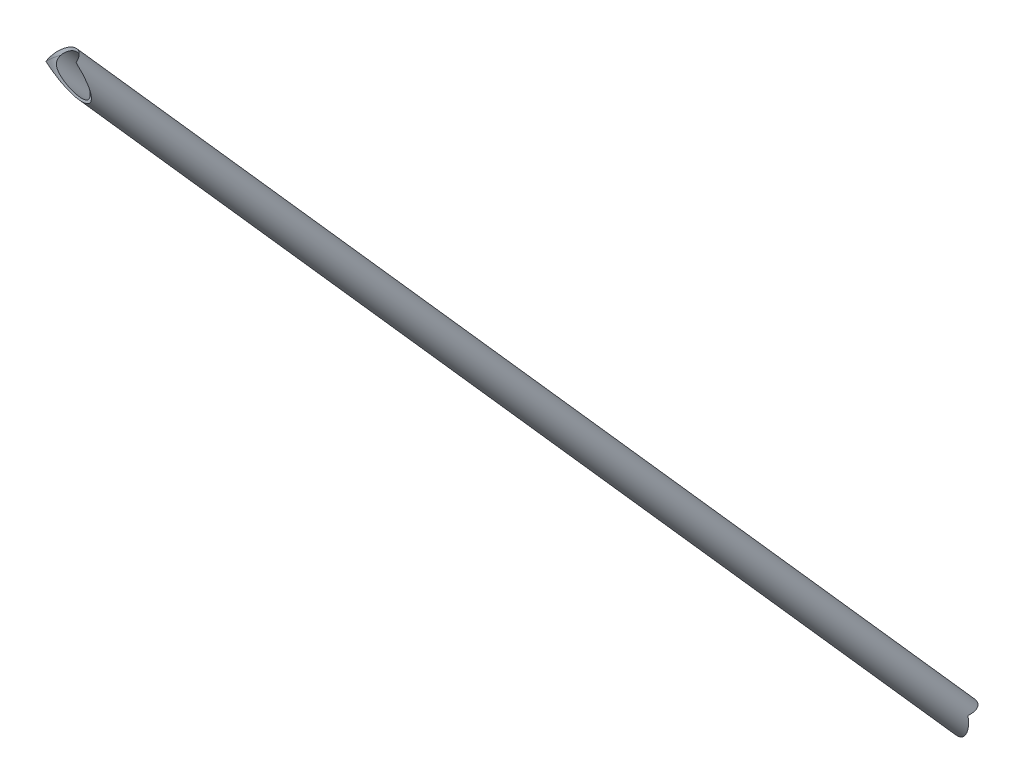
ISO-10303-21;
HEADER;
FILE_DESCRIPTION(('STEP AP214'),'2;1');
FILE_NAME('part.step','',(''),(''),'','','');
FILE_SCHEMA(('AUTOMOTIVE_DESIGN { 1 0 10303 214 1 1 1 1 }'));
ENDSEC;
DATA;
#1=APPLICATION_CONTEXT('core data for automotive mechanical design processes');
#2=APPLICATION_PROTOCOL_DEFINITION('international standard','automotive_design',2000,#1);
#3=PRODUCT_CONTEXT('',#1,'mechanical');
#4=PRODUCT('Part','Part','',(#3));
#5=PRODUCT_RELATED_PRODUCT_CATEGORY('part','',(#4));
#6=PRODUCT_DEFINITION_FORMATION('','',#4);
#7=PRODUCT_DEFINITION_CONTEXT('part definition',#1,'design');
#8=PRODUCT_DEFINITION('design','',#6,#7);
#9=PRODUCT_DEFINITION_SHAPE('','',#8);
#10=(LENGTH_UNIT() NAMED_UNIT(*) SI_UNIT(.MILLI.,.METRE.));
#11=(NAMED_UNIT(*) PLANE_ANGLE_UNIT() SI_UNIT($,.RADIAN.));
#12=(NAMED_UNIT(*) SI_UNIT($,.STERADIAN.) SOLID_ANGLE_UNIT());
#13=UNCERTAINTY_MEASURE_WITH_UNIT(LENGTH_MEASURE(1.E-05),#10,'distance_accuracy_value','');
#14=(GEOMETRIC_REPRESENTATION_CONTEXT(3) GLOBAL_UNCERTAINTY_ASSIGNED_CONTEXT((#13)) GLOBAL_UNIT_ASSIGNED_CONTEXT((#10,
#11,#12)) REPRESENTATION_CONTEXT('',''));
#15=CARTESIAN_POINT('',(0.,0.,0.));
#16=DIRECTION('',(0.,0.,1.));
#17=DIRECTION('',(1.,0.,0.));
#18=AXIS2_PLACEMENT_3D('',#15,#16,#17);
#19=CARTESIAN_POINT('',(-271.504604576379,378.994436719432,-750.538321143177));
#20=DIRECTION('',(0.,-1.,0.));
#21=DIRECTION('',(0.,0.,-1.));
#22=AXIS2_PLACEMENT_3D('',#19,#20,#21);
#23=PLANE('',#22);
#24=CARTESIAN_POINT('',(264.151567479874,378.994436719446,-749.62837042446));
#25=DIRECTION('',(0.,-1.,0.));
#26=DIRECTION('',(0.293467227757395,0.,-0.95596913456052));
#27=AXIS2_PLACEMENT_3D('',#24,#25,#26);
#28=ELLIPSE('',#27,14.8413310360351,11.049);
#29=CARTESIAN_POINT('',(253.024555644145,378.994436719446,-750.538321143169));
#30=VERTEX_POINT('',#29);
#31=CARTESIAN_POINT('',(275.515253280419,378.994436719446,-750.538321143169));
#32=VERTEX_POINT('',#31);
#33=EDGE_CURVE('E147',#30,#32,#28,.T.);
#34=ORIENTED_EDGE('',*,*,#33,.F.);
#35=DIRECTION('',(-1.,0.,0.));
#36=VECTOR('',#35,1.);
#37=CARTESIAN_POINT('',(-271.504604576379,378.994436719432,-750.538321143177));
#38=LINE('',#37,#36);
#39=CARTESIAN_POINT('',(251.338051674676,378.994436719446,-750.538321143169));
#40=VERTEX_POINT('',#39);
#41=EDGE_CURVE('E11',#30,#40,#38,.T.);
#42=ORIENTED_EDGE('',*,*,#41,.T.);
#43=CARTESIAN_POINT('',(264.151567479874,378.994436719446,-749.62837042446));
#44=DIRECTION('',(0.,1.,0.));
#45=DIRECTION('',(0.293467227757395,0.,-0.95596913456052));
#46=AXIS2_PLACEMENT_3D('',#43,#44,#45);
#47=ELLIPSE('',#46,17.0590011908449,12.7);
#48=CARTESIAN_POINT('',(277.201757249888,378.994436719446,-750.538321143169));
#49=VERTEX_POINT('',#48);
#50=EDGE_CURVE('E53',#49,#40,#47,.T.);
#51=ORIENTED_EDGE('',*,*,#50,.F.);
#52=DIRECTION('',(1.,0.,0.));
#53=VECTOR('',#52,1.);
#54=CARTESIAN_POINT('',(1.38777878078145E-11,378.994436719439,-750.538321143173));
#55=LINE('',#54,#53);
#56=EDGE_CURVE('E65',#32,#49,#55,.T.);
#57=ORIENTED_EDGE('',*,*,#56,.F.);
#58=EDGE_LOOP('',(#34,#42,#51,#57));
#59=FACE_BOUND('',#58,.T.);
#60=ADVANCED_FACE('F43',(#59),#23,.T.);
#61=CARTESIAN_POINT('',(76.9133172811853,1090.43072922397,-139.699999999991));
#62=DIRECTION('',(0.195933492226996,-0.744475005184671,-0.638253110669285));
#63=DIRECTION('',(0.,0.650868778766476,-0.759190248111128));
#64=AXIS2_PLACEMENT_3D('',#61,#62,#63);
#65=CYLINDRICAL_SURFACE('',#64,12.7);
#66=ORIENTED_EDGE('',*,*,#50,.T.);
#67=CARTESIAN_POINT('',(264.43090779031,377.933046567633,-750.538321143169));
#68=DIRECTION('',(0.,0.,-1.));
#69=DIRECTION('',(0.254516402456839,-0.967068457184097,0.));
#70=AXIS2_PLACEMENT_3D('',#67,#68,#69);
#71=ELLIPSE('',#70,19.898062050466,12.7);
#72=EDGE_CURVE('E60',#49,#40,#71,.T.);
#73=ORIENTED_EDGE('',*,*,#72,.F.);
#74=EDGE_LOOP('',(#66,#73));
#75=FACE_BOUND('',#74,.T.);
#76=CARTESIAN_POINT('',(76.9133172811852,1090.43072922397,-139.699999999991));
#77=DIRECTION('',(-0.243854446276009,0.273005986325056,-0.930592682360067));
#78=DIRECTION('',(0.297604334848648,-0.892197949254432,-0.339727065782934));
#79=AXIS2_PLACEMENT_3D('',#76,#77,#78);
#80=ELLIPSE('',#79,37.0339818746205,12.7);
#81=CARTESIAN_POINT('',(65.190958131739,1085.86136610261,-137.968752866682));
#82=VERTEX_POINT('',#81);
#83=CARTESIAN_POINT('',(88.6356764306318,1095.00009234532,-141.4312471333));
#84=VERTEX_POINT('',#83);
#85=EDGE_CURVE('E98',#82,#84,#80,.F.);
#86=ORIENTED_EDGE('',*,*,#85,.F.);
#87=CARTESIAN_POINT('',(88.6356764306312,1095.00009234532,-141.4312471333));
#88=CARTESIAN_POINT('',(88.6331386739462,1095.00300760976,-141.44073609264));
#89=CARTESIAN_POINT('',(88.6305906927773,1095.00591889996,-141.450223680085));
#90=CARTESIAN_POINT('',(88.529170472672,1095.12117964033,-141.826305435994));
#91=CARTESIAN_POINT('',(88.4150505584565,1095.22758503346,-142.190814102359));
#92=CARTESIAN_POINT('',(88.1571196513942,1095.42758854091,-142.91297620906));
#93=CARTESIAN_POINT('',(88.0132874216946,1095.52117741461,-143.270624545054));
#94=CARTESIAN_POINT('',(87.6964938475006,1095.69492887728,-143.977331765322));
#95=CARTESIAN_POINT('',(87.5234593875079,1095.77505673253,-144.326366504647));
#96=CARTESIAN_POINT('',(87.1496324132532,1095.92085883499,-145.012379503742));
#97=CARTESIAN_POINT('',(86.9488399319954,1095.9865330994,-145.349357777847));
#98=CARTESIAN_POINT('',(86.5207573736381,1096.10277563143,-146.008796830273));
#99=CARTESIAN_POINT('',(86.2934667906216,1096.15334361058,-146.331257331249));
#100=CARTESIAN_POINT('',(85.8138184627126,1096.2387951511,-146.959203611213));
#101=CARTESIAN_POINT('',(85.561459430913,1096.27367790675,-147.26468851749));
#102=CARTESIAN_POINT('',(85.033502416069,1096.32724591394,-147.856003083025));
#103=CARTESIAN_POINT('',(84.7579214580214,1096.34594292051,-148.141846867667));
#104=CARTESIAN_POINT('',(84.1851925404119,1096.36679324963,-148.691699709105));
#105=CARTESIAN_POINT('',(83.8880454124334,1096.36894720973,-148.955709606967));
#106=CARTESIAN_POINT('',(83.2820474066564,1096.35660053738,-149.453107471932));
#107=CARTESIAN_POINT('',(82.9736878391083,1096.34252297753,-149.687104398789));
#108=CARTESIAN_POINT('',(82.3405125081698,1096.29826916763,-150.129991239387));
#109=CARTESIAN_POINT('',(82.0156968320812,1096.26809300297,-150.338881286304));
#110=CARTESIAN_POINT('',(81.351954576365,1096.19165117086,-150.729492995473));
#111=CARTESIAN_POINT('',(81.0130292525002,1096.14538693258,-150.911217068924));
#112=CARTESIAN_POINT('',(80.3235824343021,1096.03692852965,-151.245596947232));
#113=CARTESIAN_POINT('',(79.9730615328377,1095.97473517836,-151.398254235555));
#114=CARTESIAN_POINT('',(79.2821226041767,1095.83848877573,-151.665434166422));
#115=CARTESIAN_POINT('',(78.9421629940078,1095.76524528265,-151.781556591513));
#116=CARTESIAN_POINT('',(78.256821380982,1095.60521713555,-151.984893341701));
#117=CARTESIAN_POINT('',(77.9114395543792,1095.51843292086,-152.072108604423));
#118=CARTESIAN_POINT('',(77.2180124385308,1095.33194462672,-152.216522876912));
#119=CARTESIAN_POINT('',(76.8699680221113,1095.23224462367,-152.273731328619));
#120=CARTESIAN_POINT('',(76.1738814667495,1095.02065795879,-152.357342460922));
#121=CARTESIAN_POINT('',(75.8258393283099,1094.90877180182,-152.383746417219));
#122=CARTESIAN_POINT('',(75.1514508478521,1094.68011849221,-152.404637650789));
#123=CARTESIAN_POINT('',(74.8249530245744,1094.56394669761,-152.400780876278));
#124=CARTESIAN_POINT('',(74.1769452938658,1094.32242378631,-152.36486873507));
#125=CARTESIAN_POINT('',(73.8554351876063,1094.19707303667,-152.332814495382));
#126=CARTESIAN_POINT('',(73.2198808877598,1093.93822295045,-152.240616258439));
#127=CARTESIAN_POINT('',(72.9058352786134,1093.80472517626,-152.180477632469));
#128=CARTESIAN_POINT('',(72.2875082080453,1093.53065883591,-152.032500522399));
#129=CARTESIAN_POINT('',(71.9832266310915,1093.39009035345,-151.944662366184));
#130=CARTESIAN_POINT('',(71.3956523516667,1093.10736840236,-151.745010721591));
#131=CARTESIAN_POINT('',(71.1120037638824,1092.96538926172,-151.633996325974));
#132=CARTESIAN_POINT('',(70.5579565108528,1092.67699543433,-151.387412411099));
#133=CARTESIAN_POINT('',(70.2875574972304,1092.53058086437,-151.251843537905));
#134=CARTESIAN_POINT('',(69.7617811561431,1092.23444501301,-150.957237836266));
#135=CARTESIAN_POINT('',(69.5064038001979,1092.08472373788,-150.798201052317));
#136=CARTESIAN_POINT('',(69.0122608934828,1091.78309973126,-150.457942880013));
#137=CARTESIAN_POINT('',(68.7734956110834,1091.63119696459,-150.276721133387));
#138=CARTESIAN_POINT('',(68.311702039997,1091.32480519111,-149.891646444406));
#139=CARTESIAN_POINT('',(68.0888530250433,1091.1703054701,-149.68758714394));
#140=CARTESIAN_POINT('',(67.6627587005486,1090.86130458341,-149.259954901512));
#141=CARTESIAN_POINT('',(67.459513399477,1090.70680341774,-149.03638195112));
#142=CARTESIAN_POINT('',(67.0736491716919,1090.39883912832,-148.571457225022));
#143=CARTESIAN_POINT('',(66.8910297096323,1090.24537597772,-148.330105911025));
#144=CARTESIAN_POINT('',(66.5472177290438,1089.94044298493,-147.83140146162));
#145=CARTESIAN_POINT('',(66.3860266876276,1089.7889732808,-147.574047224885));
#146=CARTESIAN_POINT('',(66.0785566224608,1089.48177773424,-147.032572175067));
#147=CARTESIAN_POINT('',(65.9333535515479,1089.32619280297,-146.747760307178));
#148=CARTESIAN_POINT('',(65.6676937058021,1089.01913595937,-146.164706221925));
#149=CARTESIAN_POINT('',(65.5472375710301,1088.86766415352,-145.866463657429));
#150=CARTESIAN_POINT('',(65.3313277222977,1088.56955536396,-145.258397167737));
#151=CARTESIAN_POINT('',(65.2358947397196,1088.42292247659,-144.948563881053));
#152=CARTESIAN_POINT('',(65.070347659638,1088.13537654692,-144.319609531224));
#153=CARTESIAN_POINT('',(65.0002356216158,1087.9944639707,-144.000487714875));
#154=CARTESIAN_POINT('',(64.8778659534813,1087.70097081964,-143.312631056418));
#155=CARTESIAN_POINT('',(64.8291566994143,1087.54928430136,-142.942879236317));
#156=CARTESIAN_POINT('',(64.764171187888,1087.25505225719,-142.197120524903));
#157=CARTESIAN_POINT('',(64.7478835127252,1087.11250353042,-141.821115882662));
#158=CARTESIAN_POINT('',(64.7474786616967,1086.83745123685,-141.066017131582));
#159=CARTESIAN_POINT('',(64.7633190548603,1086.70493466054,-140.686927755265));
#160=CARTESIAN_POINT('',(64.8267431484327,1086.45049631106,-139.92803904138));
#161=CARTESIAN_POINT('',(64.8743090541369,1086.32856864193,-139.548240220756));
#162=CARTESIAN_POINT('',(64.9702564176089,1086.1519363481,-138.972995339858));
#163=CARTESIAN_POINT('',(65.0072202137611,1086.09312878407,-138.77682589339));
#164=CARTESIAN_POINT('',(65.0894577738585,1085.97862933602,-138.385437854768));
#165=CARTESIAN_POINT('',(65.1347260405903,1085.92293542251,-138.190218720789));
#166=CARTESIAN_POINT('',(65.1863834662433,1085.86633932743,-137.986671367008));
#167=CARTESIAN_POINT('',(65.1886664377217,1085.8638510269,-137.977711434651));
#168=CARTESIAN_POINT('',(65.1909581317383,1085.86136610261,-137.968752866682));
#169=B_SPLINE_CURVE_WITH_KNOTS('',3,(#87,#88,#89,#90,#91,#92,#93,#94,#95,#96,#97,#98,#99,#100,
#101,#102,#103,#104,#105,#106,#107,#108,#109,#110,#111,#112,#113,#114,#115,#116,#117,#118,#119,
#120,#121,#122,#123,#124,#125,#126,#127,#128,#129,#130,#131,#132,#133,#134,#135,#136,#137,#138,
#139,#140,#141,#142,#143,#144,#145,#146,#147,#148,#149,#150,#151,#152,#153,#154,#155,#156,#157,
#158,#159,#160,#161,#162,#163,#164,#165,#166,#167,#168),.UNSPECIFIED.,.F.,.F.,(4,2,2,2,2,2,2,2,
2,2,2,2,2,2,2,2,2,2,2,2,2,2,2,2,2,2,2,2,2,2,2,2,2,2,2,2,2,2,2,2,4),(0.,0.0307382089206338,
1.21862196413565,2.40735771430638,3.59911517627019,4.79087122125133,5.98265002365449,
7.17449003853583,8.36546374223201,9.55639154680229,10.7169664486453,11.8775351941257,
13.0380008685523,14.1984073011009,15.296916896178,16.395390856807,17.493518964052,
18.5916015930632,19.6300309538112,20.6684188120136,21.7066081544173,22.7447852079845,
23.751789318085,24.758766936342,25.7657426453638,26.7727346184595,27.7896995570563,
28.8066649350154,29.8236039114507,30.8406129516338,31.9060625596637,32.971539721275,
34.0378968485724,35.1043406886018,36.3106727873859,37.5165799845732,38.7208955985359,
39.9245362844232,40.5486966163982,41.17244526143,41.2011707651675),.UNSPECIFIED.);
#170=EDGE_CURVE('E83',#84,#82,#169,.T.);
#171=ORIENTED_EDGE('',*,*,#170,.F.);
#172=EDGE_LOOP('',(#86,#171));
#173=FACE_BOUND('',#172,.T.);
#174=ADVANCED_FACE('F104',(#75,#173),#65,.T.);
#175=CARTESIAN_POINT('',(76.9133172811853,1090.43072922397,-139.699999999991));
#176=DIRECTION('',(0.195933492226996,-0.744475005184671,-0.638253110669285));
#177=DIRECTION('',(0.,0.650868778766476,-0.759190248111128));
#178=AXIS2_PLACEMENT_3D('',#175,#176,#177);
#179=CYLINDRICAL_SURFACE('',#178,11.049);
#180=ORIENTED_EDGE('',*,*,#33,.T.);
#181=CARTESIAN_POINT('',(264.43090779031,377.933046567633,-750.538321143169));
#182=DIRECTION('',(0.,0.,-1.));
#183=DIRECTION('',(0.254516402456839,-0.967068457184097,0.));
#184=AXIS2_PLACEMENT_3D('',#181,#182,#183);
#185=ELLIPSE('',#184,17.3113139839054,11.049);
#186=EDGE_CURVE('E94',#32,#30,#185,.T.);
#187=ORIENTED_EDGE('',*,*,#186,.T.);
#188=EDGE_LOOP('',(#180,#187));
#189=FACE_BOUND('',#188,.T.);
#190=CARTESIAN_POINT('',(88.7463353244457,1087.99882496934,-147.02614190003));
#191=CARTESIAN_POINT('',(88.6547923137507,1088.20840788501,-147.061892385958));
#192=CARTESIAN_POINT('',(88.5588753429904,1088.41528514934,-147.103244408292));
#193=CARTESIAN_POINT('',(88.357440881388,1088.82185141506,-147.197943589079));
#194=CARTESIAN_POINT('',(88.2519095106341,1089.02152942408,-147.251308258423));
#195=CARTESIAN_POINT('',(88.0308835493604,1089.41089586587,-147.370602487461));
#196=CARTESIAN_POINT('',(87.9154096997106,1089.60060382586,-147.436506221325));
#197=CARTESIAN_POINT('',(87.673938888399,1089.96803510833,-147.58091170392));
#198=CARTESIAN_POINT('',(87.5479476524968,1090.14576485782,-147.659406619075));
#199=CARTESIAN_POINT('',(87.2841649406985,1090.48858913155,-147.828961573255));
#200=CARTESIAN_POINT('',(87.1462834380052,1090.65356531027,-147.920121382344));
#201=CARTESIAN_POINT('',(86.8598571837597,1090.96743401841,-148.112882017579));
#202=CARTESIAN_POINT('',(86.7113104906621,1091.11632360692,-148.214484746269));
#203=CARTESIAN_POINT('',(86.4043329799139,1091.39668048101,-148.425678481332));
#204=CARTESIAN_POINT('',(86.2459163464842,1091.52817195726,-148.535258060564));
#205=CARTESIAN_POINT('',(85.9197228108656,1091.77362715338,-148.759911914731));
#206=CARTESIAN_POINT('',(85.7519460785138,1091.88759119114,-148.874986089962));
#207=CARTESIAN_POINT('',(85.4203469299541,1092.09059323831,-149.099489149443));
#208=CARTESIAN_POINT('',(85.2571263994723,1092.1808421033,-149.208718826794));
#209=CARTESIAN_POINT('',(84.9239116093323,1092.34705781527,-149.427649813486));
#210=CARTESIAN_POINT('',(84.7539177731316,1092.4230255534,-149.537351092962));
#211=CARTESIAN_POINT('',(84.4075090176749,1092.56147867362,-149.755597512007));
#212=CARTESIAN_POINT('',(84.2310865916955,1092.62394766245,-149.86414109532));
#213=CARTESIAN_POINT('',(83.8725352680419,1092.73607060632,-150.078405640752));
#214=CARTESIAN_POINT('',(83.6904055797508,1092.785722777,-150.184126208013));
#215=CARTESIAN_POINT('',(83.2828942215678,1092.88196503088,-150.412759620698));
#216=CARTESIAN_POINT('',(83.0563319447682,1092.92581695467,-150.534727347628));
#217=CARTESIAN_POINT('',(82.5965537740382,1092.99725001794,-150.77062044123));
#218=CARTESIAN_POINT('',(82.3633372464671,1093.02482960245,-150.884545038396));
#219=CARTESIAN_POINT('',(81.8911088632483,1093.06484677486,-151.102715696012));
#220=CARTESIAN_POINT('',(81.6520961206814,1093.07728203032,-151.206960263318));
#221=CARTESIAN_POINT('',(81.1692252710726,1093.0879990818,-151.40436525889));
#222=CARTESIAN_POINT('',(80.9253669194075,1093.08628016146,-151.497525125894));
#223=CARTESIAN_POINT('',(80.3946527848133,1093.06823742843,-151.685429849765));
#224=CARTESIAN_POINT('',(80.1071248728102,1093.04963510569,-151.778071967869));
#225=CARTESIAN_POINT('',(79.5283958699782,1092.99580841502,-151.945367888271));
#226=CARTESIAN_POINT('',(79.2371944203863,1092.96058241116,-152.020019919093));
#227=CARTESIAN_POINT('',(78.6527030607349,1092.8745800157,-152.150121526792));
#228=CARTESIAN_POINT('',(78.3594125323556,1092.82379881597,-152.205565155019));
#229=CARTESIAN_POINT('',(77.7725908103508,1092.70769234501,-152.296251464537));
#230=CARTESIAN_POINT('',(77.4790596190898,1092.64236721502,-152.331494341968));
#231=CARTESIAN_POINT('',(76.8851554256583,1092.49604161734,-152.381784224416));
#232=CARTESIAN_POINT('',(76.5848281528066,1092.41464470538,-152.396221889673));
#233=CARTESIAN_POINT('',(75.9878854110612,1092.23844131747,-152.402479384814));
#234=CARTESIAN_POINT('',(75.6912700445917,1092.14363447237,-152.394298591955));
#235=CARTESIAN_POINT('',(75.1038756501379,1091.9415782404,-152.355121845503));
#236=CARTESIAN_POINT('',(74.8130959746483,1091.83433024301,-152.324128437649));
#237=CARTESIAN_POINT('',(74.2394370198977,1091.60830649215,-152.239425283996));
#238=CARTESIAN_POINT('',(73.9565576026751,1091.48953094015,-152.18571593515));
#239=CARTESIAN_POINT('',(73.4043362382557,1091.24292246051,-152.056809263204));
#240=CARTESIAN_POINT('',(73.1348671619681,1091.11522530559,-151.981896500332));
#241=CARTESIAN_POINT('',(72.6075901230408,1090.85023234599,-151.810985653));
#242=CARTESIAN_POINT('',(72.3497821116187,1090.71293658147,-151.714987656756));
#243=CARTESIAN_POINT('',(71.8476305052454,1090.42939075841,-151.502824890398));
#244=CARTESIAN_POINT('',(71.6032910935658,1090.2831379473,-151.386653900646));
#245=CARTESIAN_POINT('',(71.1299678715285,1089.98227314135,-151.13540630914));
#246=CARTESIAN_POINT('',(70.9009839758132,1089.82766119298,-151.000329812491));
#247=CARTESIAN_POINT('',(70.4592764905657,1089.50986163246,-150.712273702619));
#248=CARTESIAN_POINT('',(70.2466163483768,1089.34664434515,-150.559229556415));
#249=CARTESIAN_POINT('',(69.8401639173539,1089.01227938889,-150.237507763979));
#250=CARTESIAN_POINT('',(69.6463727999226,1088.84113122856,-150.068829148417));
#251=CARTESIAN_POINT('',(69.2795330441991,1088.49092367282,-149.71831495331));
#252=CARTESIAN_POINT('',(69.1064601943667,1088.31187385313,-149.536495137358));
#253=CARTESIAN_POINT('',(68.7824512357389,1087.94506635464,-149.162248486651));
#254=CARTESIAN_POINT('',(68.6315110699459,1087.75731028005,-148.969823604761));
#255=CARTESIAN_POINT('',(68.3957121209939,1087.43046452159,-148.637320631198));
#256=CARTESIAN_POINT('',(68.304703376206,1087.29390510115,-148.499085779925));
#257=CARTESIAN_POINT('',(68.1349020058206,1087.0154691759,-148.220587677371));
#258=CARTESIAN_POINT('',(68.0561044719237,1086.87359483603,-148.080325265983));
#259=CARTESIAN_POINT('',(67.9112932960583,1086.58363947557,-147.799293315202));
#260=CARTESIAN_POINT('',(67.8452900306327,1086.43555353459,-147.658523457715));
#261=CARTESIAN_POINT('',(67.7564515018888,1086.20818749291,-147.448624365962));
#262=CARTESIAN_POINT('',(67.7285211099905,1086.13148446797,-147.378831110517));
#263=CARTESIAN_POINT('',(67.6761470698765,1085.97621961429,-147.239984924709));
#264=CARTESIAN_POINT('',(67.6517039442066,1085.89765750903,-147.170932106727));
#265=CARTESIAN_POINT('',(67.6290488963503,1085.81810934335,-147.102408226526));
#266=B_SPLINE_CURVE_WITH_KNOTS('',3,(#190,#191,#192,#193,#194,#195,#196,#197,#198,#199,#200,
#201,#202,#203,#204,#205,#206,#207,#208,#209,#210,#211,#212,#213,#214,#215,#216,#217,#218,#219,
#220,#221,#222,#223,#224,#225,#226,#227,#228,#229,#230,#231,#232,#233,#234,#235,#236,#237,#238,
#239,#240,#241,#242,#243,#244,#245,#246,#247,#248,#249,#250,#251,#252,#253,#254,#255,#256,#257,
#258,#259,#260,#261,#262,#263,#264,#265),.UNSPECIFIED.,.F.,.F.,(4,2,2,2,2,2,2,2,2,2,2,2,2,2,2,2,
2,2,2,2,2,2,2,2,2,2,2,2,2,2,2,2,2,2,2,2,2,4),(0.,0.694536049670348,1.39009116040017,
2.08422889649608,2.77799117193928,3.47756634785941,4.1772692025025,4.87598871713629,
5.57469555776287,6.2225170891214,6.8702981829349,7.51886159379517,8.16751524965704,
8.94980065646328,9.7321608054336,10.5146414337009,11.2971616651999,12.2040908235174,
13.1111092502789,14.0184083210087,14.9256985821033,15.8590562077872,16.7924395314693,
17.7257187115278,18.6589815835984,19.5802695306012,20.5015536231591,21.4231222674661,
22.3446857885724,23.2696667631992,24.1947051247452,25.1186517016405,26.0424287036409,
26.6857562472449,27.3288245306991,27.9724121998601,28.2945431705649,28.6167223600836),.UNSPECIFIED.);
#267=CARTESIAN_POINT('',(83.2243835741694,1092.89077614865,-150.442840005033));
#268=VERTEX_POINT('',#267);
#269=CARTESIAN_POINT('',(68.1333714264521,1087.00831567353,-148.21408458248));
#270=VERTEX_POINT('',#269);
#271=EDGE_CURVE('E111',#268,#270,#266,.T.);
#272=ORIENTED_EDGE('',*,*,#271,.T.);
#273=CARTESIAN_POINT('',(68.1333714264517,1087.00831567353,-148.214084582479));
#274=CARTESIAN_POINT('',(68.0490976627356,1086.86077878294,-148.067937646689));
#275=CARTESIAN_POINT('',(67.9715363838032,1086.71046625413,-147.920633360321));
#276=CARTESIAN_POINT('',(67.8304409419802,1086.40351022015,-147.625577974404));
#277=CARTESIAN_POINT('',(67.7669208371357,1086.24686055416,-147.477826575847));
#278=CARTESIAN_POINT('',(67.6541310688043,1085.92517489103,-147.182605910883));
#279=CARTESIAN_POINT('',(67.6050070314796,1085.76007179663,-147.035153573041));
#280=CARTESIAN_POINT('',(67.5225026996528,1085.42230371869,-146.744606931399));
#281=CARTESIAN_POINT('',(67.4891183164063,1085.24964071175,-146.601511504833));
#282=CARTESIAN_POINT('',(67.4383390519756,1084.89466756212,-146.321343438928));
#283=CARTESIAN_POINT('',(67.4210867928452,1084.71228616338,-146.18433453598));
#284=CARTESIAN_POINT('',(67.4032535173016,1084.3391463628,-145.920980982938));
#285=CARTESIAN_POINT('',(67.4026720852773,1084.14838816993,-145.794636067066));
#286=CARTESIAN_POINT('',(67.4177755091415,1083.7601254083,-145.556568630019));
#287=CARTESIAN_POINT('',(67.43336188507,1083.56266868757,-145.444762195261));
#288=CARTESIAN_POINT('',(67.4796344262958,1083.16105801741,-145.237528301725));
#289=CARTESIAN_POINT('',(67.5103185004076,1082.95690499914,-145.142098577072));
#290=CARTESIAN_POINT('',(67.5802457892738,1082.57050970203,-144.980450370564));
#291=CARTESIAN_POINT('',(67.6178535191028,1082.38887720631,-144.912046069389));
#292=CARTESIAN_POINT('',(67.7018833051924,1082.02303319319,-144.789038928905));
#293=CARTESIAN_POINT('',(67.7483047701934,1081.83882184956,-144.734435164375));
#294=CARTESIAN_POINT('',(67.848686962871,1081.46849968016,-144.638478553656));
#295=CARTESIAN_POINT('',(67.9026669184376,1081.2823851688,-144.597160416996));
#296=CARTESIAN_POINT('',(68.0167498208753,1080.90970116874,-144.527032820764));
#297=CARTESIAN_POINT('',(68.076853550881,1080.72313162484,-144.498224963546));
#298=CARTESIAN_POINT('',(68.2507096792254,1080.20521972254,-144.433899603833));
#299=CARTESIAN_POINT('',(68.3698272940955,1079.87414839223,-144.410592834079));
#300=CARTESIAN_POINT('',(68.6189003373898,1079.21531699437,-144.39246703325));
#301=CARTESIAN_POINT('',(68.7488656833128,1078.88756027095,-144.397674358337));
#302=CARTESIAN_POINT('',(69.0171631914433,1078.23514794269,-144.430273543342));
#303=CARTESIAN_POINT('',(69.1555271402632,1077.9105102992,-144.457755264405));
#304=CARTESIAN_POINT('',(69.3676260117449,1077.42718581391,-144.51192211886));
#305=CARTESIAN_POINT('',(69.4390723714438,1077.26670899956,-144.532130741402));
#306=CARTESIAN_POINT('',(69.5833685180975,1076.94691329227,-144.576371260214));
#307=CARTESIAN_POINT('',(69.6562183094878,1076.78759440299,-144.600403168568));
#308=CARTESIAN_POINT('',(69.8537792903199,1076.36087154259,-144.669534210936));
#309=CARTESIAN_POINT('',(69.9796848850025,1076.09452508382,-144.717751436592));
#310=CARTESIAN_POINT('',(70.2348415213591,1075.56497615152,-144.822048080246));
#311=CARTESIAN_POINT('',(70.3640929676222,1075.30177406389,-144.87812845273));
#312=CARTESIAN_POINT('',(70.6258031158135,1074.77831664375,-144.996818417935));
#313=CARTESIAN_POINT('',(70.7582631583062,1074.518062612,-145.059430777175));
#314=CARTESIAN_POINT('',(71.0262583177709,1074.0005175811,-145.190107115816));
#315=CARTESIAN_POINT('',(71.1617935905866,1073.74322673312,-145.258171371948));
#316=CARTESIAN_POINT('',(71.573558268021,1072.97460346358,-145.469529190899));
#317=CARTESIAN_POINT('',(71.8543945992424,1072.46762303984,-145.619729910557));
#318=CARTESIAN_POINT('',(72.4286175189632,1071.46527112897,-145.933518511874));
#319=CARTESIAN_POINT('',(72.7220011383182,1070.96989693787,-146.097103234667));
#320=CARTESIAN_POINT('',(73.3235986661082,1069.98882027023,-146.435218771474));
#321=CARTESIAN_POINT('',(73.631871651769,1069.50316937271,-146.609794196321));
#322=CARTESIAN_POINT('',(74.2633791849462,1068.54461363896,-146.966972147972));
#323=CARTESIAN_POINT('',(74.5866154329924,1068.07171026116,-147.149575587016));
#324=CARTESIAN_POINT('',(75.2490919220875,1067.14112050464,-147.520765275666));
#325=CARTESIAN_POINT('',(75.588300880049,1066.68340714793,-147.709339611613));
#326=CARTESIAN_POINT('',(76.2854296710029,1065.78465617003,-148.091461936274));
#327=CARTESIAN_POINT('',(76.6433457324669,1065.34361521818,-148.285008918485));
#328=CARTESIAN_POINT('',(77.1996654059684,1064.69345976614,-148.579908247596));
#329=CARTESIAN_POINT('',(77.3900668878473,1064.4768336822,-148.679849315749));
#330=CARTESIAN_POINT('',(77.7769480992221,1064.04948585732,-148.880566172643));
#331=CARTESIAN_POINT('',(77.9734274398265,1063.83876374027,-148.981341907679));
#332=CARTESIAN_POINT('',(78.3732669166331,1063.42375379278,-149.183691971248));
#333=CARTESIAN_POINT('',(78.5766354773666,1063.21947447685,-149.285267151695));
#334=CARTESIAN_POINT('',(78.9906491020884,1062.81866388037,-149.488892432868));
#335=CARTESIAN_POINT('',(79.2012939361284,1062.62213235538,-149.590942518498));
#336=CARTESIAN_POINT('',(79.6287996758459,1062.23974836888,-149.794421323131));
#337=CARTESIAN_POINT('',(79.845593365953,1062.0538199666,-149.895848045539));
#338=CARTESIAN_POINT('',(80.2879476771602,1061.69252122613,-150.098651752094));
#339=CARTESIAN_POINT('',(80.5135098722645,1061.51715279808,-150.200028723974));
#340=CARTESIAN_POINT('',(80.9738293387474,1061.17960146897,-150.402082675321));
#341=CARTESIAN_POINT('',(81.2085664500924,1061.01739182897,-150.502760673776));
#342=CARTESIAN_POINT('',(81.688610911633,1060.70880907614,-150.702990883786));
#343=CARTESIAN_POINT('',(81.9339123345798,1060.56242724069,-150.80254368806));
#344=CARTESIAN_POINT('',(82.3540726742328,1060.33417751114,-150.967429921075));
#345=CARTESIAN_POINT('',(82.5257533639037,1060.24686015705,-151.033313807549));
#346=CARTESIAN_POINT('',(82.8746942790816,1060.08289656823,-151.163791397267));
#347=CARTESIAN_POINT('',(83.0519553753034,1060.00625200898,-151.228384896574));
#348=CARTESIAN_POINT('',(83.4119229364407,1059.86579133775,-151.355653344962));
#349=CARTESIAN_POINT('',(83.5946219600985,1059.80195854428,-151.418330697569));
#350=CARTESIAN_POINT('',(83.9654459660918,1059.68954775978,-151.541092796835));
#351=CARTESIAN_POINT('',(84.1535684674998,1059.64096291089,-151.601178698494));
#352=CARTESIAN_POINT('',(84.6004965749775,1059.54835867621,-151.737949386));
#353=CARTESIAN_POINT('',(84.8613397046036,1059.51166935941,-151.813227209995));
#354=CARTESIAN_POINT('',(85.3884134999832,1059.47956578791,-151.954228974304));
#355=CARTESIAN_POINT('',(85.6546382608571,1059.48410850988,-152.019962800474));
#356=CARTESIAN_POINT('',(86.0538096134694,1059.52738188064,-152.108830086354));
#357=CARTESIAN_POINT('',(86.1877059467295,1059.54813860764,-152.136980261629));
#358=CARTESIAN_POINT('',(86.4536696523515,1059.60255667181,-152.189384475927));
#359=CARTESIAN_POINT('',(86.5857370818292,1059.63621760504,-152.213638636872));
#360=CARTESIAN_POINT('',(86.846495881099,1059.71653397443,-152.257834185614));
#361=CARTESIAN_POINT('',(86.9751898325232,1059.7631791364,-152.277778961273));
#362=CARTESIAN_POINT('',(87.2279007509436,1059.8690286585,-152.313143859809));
#363=CARTESIAN_POINT('',(87.3519181758044,1059.92823178533,-152.328564426645));
#364=CARTESIAN_POINT('',(87.6772980485208,1060.10312271319,-152.363810612647));
#365=CARTESIAN_POINT('',(87.8733719031183,1060.22970219767,-152.379403916789));
#366=CARTESIAN_POINT('',(88.2452763029884,1060.51016608987,-152.398248508346));
#367=CARTESIAN_POINT('',(88.421091907195,1060.66407044062,-152.401490742268));
#368=CARTESIAN_POINT('',(88.835800678722,1061.075925905,-152.396209850881));
#369=CARTESIAN_POINT('',(89.0615079992683,1061.34707997864,-152.380891811657));
#370=CARTESIAN_POINT('',(89.3677989031843,1061.77502289772,-152.344349686039));
#371=CARTESIAN_POINT('',(89.4646566921979,1061.92147711787,-152.329871346308));
#372=CARTESIAN_POINT('',(89.64857794305,1062.22001277442,-152.297034973733));
#373=CARTESIAN_POINT('',(89.7356430074735,1062.37209328465,-152.278677577118));
#374=CARTESIAN_POINT('',(89.9683179027214,1062.80650560214,-152.22233702403));
#375=CARTESIAN_POINT('',(90.103697546811,1063.09381650387,-152.180566331965));
#376=CARTESIAN_POINT('',(90.3500684820794,1063.67749595226,-152.088877803233));
#377=CARTESIAN_POINT('',(90.4610380484432,1063.97387230208,-152.038952777557));
#378=CARTESIAN_POINT('',(90.6627262079304,1064.57299693959,-151.932787388411));
#379=CARTESIAN_POINT('',(90.7533994398245,1064.87575787749,-151.876533292903));
#380=CARTESIAN_POINT('',(90.9173228421221,1065.48485029266,-151.759237618788));
#381=CARTESIAN_POINT('',(90.9905790307919,1065.79118049813,-151.69819770359));
#382=CARTESIAN_POINT('',(91.1504939397597,1066.5382620884,-151.54535134064));
#383=CARTESIAN_POINT('',(91.2294054411073,1066.98026449689,-151.451586350041));
#384=CARTESIAN_POINT('',(91.3623364177149,1067.86689350152,-151.258595997585));
#385=CARTESIAN_POINT('',(91.4163445590589,1068.31152119942,-151.159368172456));
#386=CARTESIAN_POINT('',(91.5033822898242,1069.20270233303,-150.956898585306));
#387=CARTESIAN_POINT('',(91.5363746436055,1069.64925778324,-150.853650040836));
#388=CARTESIAN_POINT('',(91.5841035919716,1070.54262670793,-150.644575475134));
#389=CARTESIAN_POINT('',(91.5988430919445,1070.98944013002,-150.538749866839));
#390=CARTESIAN_POINT('',(91.6122480122781,1071.88517090907,-150.325011381116));
#391=CARTESIAN_POINT('',(91.6108319333637,1072.33408750357,-150.217090664982));
#392=CARTESIAN_POINT('',(91.5933508827142,1073.23149104948,-150.000638181502));
#393=CARTESIAN_POINT('',(91.5772853326397,1073.67997798322,-149.8921063902));
#394=CARTESIAN_POINT('',(91.531726803355,1074.57585132599,-149.675488583495));
#395=CARTESIAN_POINT('',(91.5022483856403,1075.02323840086,-149.567402212601));
#396=CARTESIAN_POINT('',(91.4307192024144,1075.91730495738,-149.352538782393));
#397=CARTESIAN_POINT('',(91.3886687881017,1076.36398445844,-149.24576168659));
#398=CARTESIAN_POINT('',(91.3010119727323,1077.17790234253,-149.053240712121));
#399=CARTESIAN_POINT('',(91.257340390426,1077.54525881718,-148.967108303854));
#400=CARTESIAN_POINT('',(91.1619828907655,1078.27947716202,-148.797208380804));
#401=CARTESIAN_POINT('',(91.1102970497504,1078.6463390369,-148.713440843505));
#402=CARTESIAN_POINT('',(90.998875158897,1079.37986343346,-148.549072835939));
#403=CARTESIAN_POINT('',(90.9391327794227,1079.74652556849,-148.468474920857));
#404=CARTESIAN_POINT('',(90.8114712136147,1080.47934700581,-148.311592602889));
#405=CARTESIAN_POINT('',(90.7435522084076,1080.84550631905,-148.235308104509));
#406=CARTESIAN_POINT('',(90.5995674130862,1081.57529401982,-148.088815283918));
#407=CARTESIAN_POINT('',(90.5235480868923,1081.93892531737,-148.018576084903));
#408=CARTESIAN_POINT('',(90.3624367208995,1082.66559012136,-147.885443463734));
#409=CARTESIAN_POINT('',(90.2773436162893,1083.02862355254,-147.822550905528));
#410=CARTESIAN_POINT('',(90.0972383474356,1083.75333352448,-147.70649754468));
#411=CARTESIAN_POINT('',(90.0022383326263,1084.11501117663,-147.653325037135));
#412=CARTESIAN_POINT('',(89.8008296552441,1084.83678764748,-147.559702858872));
#413=CARTESIAN_POINT('',(89.6944247814002,1085.19688694939,-147.519248980445));
#414=CARTESIAN_POINT('',(89.5038664192672,1085.80094183069,-147.465351577577));
#415=CARTESIAN_POINT('',(89.4233124018499,1086.04562652418,-147.447412160218));
#416=CARTESIAN_POINT('',(89.2549535418156,1086.53307738559,-147.42114266345));
#417=CARTESIAN_POINT('',(89.1671480060782,1086.77584336768,-147.412813503759));
#418=CARTESIAN_POINT('',(88.9831941021526,1087.25836177789,-147.407776705925));
#419=CARTESIAN_POINT('',(88.887045811182,1087.49811423388,-147.411068960229));
#420=CARTESIAN_POINT('',(88.6851075104999,1087.9729569982,-147.431568796615));
#421=CARTESIAN_POINT('',(88.5793194631758,1088.2080482436,-147.448773552088));
#422=CARTESIAN_POINT('',(88.3773476234691,1088.62818150322,-147.494753376255));
#423=CARTESIAN_POINT('',(88.2830266994453,1088.8144127519,-147.520787550098));
#424=CARTESIAN_POINT('',(88.0862977931018,1089.1804803445,-147.584781412146));
#425=CARTESIAN_POINT('',(87.9838906196092,1089.36031732539,-147.62273990875));
#426=CARTESIAN_POINT('',(87.7707198666309,1089.71098410116,-147.711199930489));
#427=CARTESIAN_POINT('',(87.6599844407815,1089.88184119481,-147.761660412279));
#428=CARTESIAN_POINT('',(87.4295204375939,1090.21295684384,-147.875306304624));
#429=CARTESIAN_POINT('',(87.3097923805901,1090.37321601144,-147.938490979284));
#430=CARTESIAN_POINT('',(87.0606854354891,1090.68185251703,-148.077246893899));
#431=CARTESIAN_POINT('',(86.931260454155,1090.83016510841,-148.152879645364));
#432=CARTESIAN_POINT('',(86.6636164323226,1091.11236130111,-148.314760561466));
#433=CARTESIAN_POINT('',(86.5253969606308,1091.24624419408,-148.401009246795));
#434=CARTESIAN_POINT('',(86.2399416171034,1091.49934397517,-148.582446734605));
#435=CARTESIAN_POINT('',(86.0926599373804,1091.61847529041,-148.677682524062));
#436=CARTESIAN_POINT('',(85.7904651592695,1091.84100066201,-148.874170083056));
#437=CARTESIAN_POINT('',(85.6355517563195,1091.94439408964,-148.975422092717));
#438=CARTESIAN_POINT('',(85.3032418405827,1092.14521935546,-149.191538242834));
#439=CARTESIAN_POINT('',(85.1251297784384,1092.24107394382,-149.306763942203));
#440=CARTESIAN_POINT('',(84.7612880511002,1092.41532748949,-149.538470537665));
#441=CARTESIAN_POINT('',(84.5755551532156,1092.49371894651,-149.654951950647));
#442=CARTESIAN_POINT('',(84.1989011303363,1092.63363516959,-149.885539529073));
#443=CARTESIAN_POINT('',(84.0080400439764,1092.69530229022,-149.99965757634));
#444=CARTESIAN_POINT('',(83.7173304002948,1092.77670500584,-150.168182177106));
#445=CARTESIAN_POINT('',(83.6197422460698,1092.80197941847,-150.223886957778));
#446=CARTESIAN_POINT('',(83.423128804795,1092.84899190579,-150.33422071832));
#447=CARTESIAN_POINT('',(83.3241036550303,1092.8707303159,-150.388849799799));
#448=CARTESIAN_POINT('',(83.2243835741695,1092.89077614865,-150.442840005033));
#449=B_SPLINE_CURVE_WITH_KNOTS('',3,(#273,#274,#275,#276,#277,#278,#279,#280,#281,#282,#283,
#284,#285,#286,#287,#288,#289,#290,#291,#292,#293,#294,#295,#296,#297,#298,#299,#300,#301,#302,
#303,#304,#305,#306,#307,#308,#309,#310,#311,#312,#313,#314,#315,#316,#317,#318,#319,#320,#321,
#322,#323,#324,#325,#326,#327,#328,#329,#330,#331,#332,#333,#334,#335,#336,#337,#338,#339,#340,
#341,#342,#343,#344,#345,#346,#347,#348,#349,#350,#351,#352,#353,#354,#355,#356,#357,#358,#359,
#360,#361,#362,#363,#364,#365,#366,#367,#368,#369,#370,#371,#372,#373,#374,#375,#376,#377,#378,
#379,#380,#381,#382,#383,#384,#385,#386,#387,#388,#389,#390,#391,#392,#393,#394,#395,#396,#397,
#398,#399,#400,#401,#402,#403,#404,#405,#406,#407,#408,#409,#410,#411,#412,#413,#414,#415,#416,
#417,#418,#419,#420,#421,#422,#423,#424,#425,#426,#427,#428,#429,#430,#431,#432,#433,#434,#435,
#436,#437,#438,#439,#440,#441,#442,#443,#444,#445,#446,#447,#448),.UNSPECIFIED.,.F.,.F.,(4,2,2,
2,2,2,2,2,2,2,2,2,2,2,2,2,2,2,2,2,2,2,2,2,2,2,2,2,2,2,2,2,2,2,2,2,2,2,2,2,2,2,2,2,2,2,2,2,2,2,2,
2,2,2,2,2,2,2,2,2,2,2,2,2,2,2,2,2,2,2,2,2,2,2,2,2,2,2,2,2,2,2,2,2,2,2,2,4),(0.,
0.672317239539175,1.34530458570347,2.02488162093224,2.70428202268348,3.38963365133069,
4.07496819384558,4.75615266040624,5.43724280250002,6.02961685443142,6.62195118164102,
7.21582067728357,7.80976621506027,8.86570634126423,9.92262265926821,10.9838242231465,
11.5142510746345,12.0446796027979,12.9400783126922,13.8355858070188,14.7314741310895,
15.6274079580465,17.4230518902725,19.2182732338637,21.0213209044144,22.8245739914047,
24.6244313985639,26.4239273267855,27.3395335780886,28.2550813650555,29.1717923026316,
30.0884742963304,30.9974432470368,31.9065761239814,32.8138127655502,33.7205468573344,
34.3309493755765,34.9414476120754,35.551145721214,36.160569220868,36.9797981742,37.798172406345,
38.2127670925896,38.6273488019328,39.0416033885555,39.4558173109093,40.1541158030431,
40.8529260585858,41.9058689430007,42.4341676911176,42.9623798566537,43.9218022502476,
44.8820750996296,45.8444731423906,46.8065381542944,48.1816161368043,49.5573193230129,
50.9354532409132,52.3133677668797,53.6982364531329,55.0831598143132,56.466583226666,
57.8499679967262,58.9893942851548,60.128809720762,61.2691256131597,62.4094162501996,
63.5434863271141,64.6776896343491,65.8105180029995,66.9429712022102,67.7174246809087,
68.4919522699075,69.2664726909115,70.0408357917616,70.6714431936937,71.3019875988248,
71.9304887708511,72.5589536043162,73.1906227231262,73.8223228365595,74.4575309434015,
75.0927644202969,75.7902513490383,76.4880372678434,77.1796827464257,77.5251498178734,
77.8705840991798),.UNSPECIFIED.);
#450=EDGE_CURVE('E100',#270,#268,#449,.T.);
#451=ORIENTED_EDGE('',*,*,#450,.T.);
#452=EDGE_LOOP('',(#272,#451));
#453=FACE_BOUND('',#452,.T.);
#454=ADVANCED_FACE('F45',(#189,#453),#179,.F.);
#455=CARTESIAN_POINT('',(-271.504604576378,353.594436719432,-750.538321143178));
#456=DIRECTION('',(0.,0.,-1.));
#457=DIRECTION('',(-1.,0.,0.));
#458=AXIS2_PLACEMENT_3D('',#455,#456,#457);
#459=PLANE('',#458);
#460=ORIENTED_EDGE('',*,*,#186,.F.);
#461=ORIENTED_EDGE('',*,*,#56,.T.);
#462=ORIENTED_EDGE('',*,*,#72,.T.);
#463=ORIENTED_EDGE('',*,*,#41,.F.);
#464=EDGE_LOOP('',(#460,#461,#462,#463));
#465=FACE_BOUND('',#464,.T.);
#466=ADVANCED_FACE('F128',(#465),#459,.T.);
#467=CARTESIAN_POINT('',(356.781525664994,372.449783946395,-139.700000000007));
#468=DIRECTION('',(-0.363182667764756,0.931717956162312,0.));
#469=DIRECTION('',(-0.931717956162311,-0.363182667764756,0.));
#470=AXIS2_PLACEMENT_3D('',#467,#468,#469);
#471=CYLINDRICAL_SURFACE('',#470,12.7);
#472=CARTESIAN_POINT('',(76.9133172811854,1090.43072922397,-139.699999999991));
#473=DIRECTION('',(-0.363182667764756,0.931717956162312,0.));
#474=DIRECTION('',(-0.931717956162311,-0.363182667764756,0.));
#475=AXIS2_PLACEMENT_3D('',#472,#473,#474);
#476=CIRCLE('',#475,12.7);
#477=EDGE_CURVE('E86',#270,#82,#476,.T.);
#478=ORIENTED_EDGE('',*,*,#477,.T.);
#479=ORIENTED_EDGE('',*,*,#85,.T.);
#480=EDGE_CURVE('E89',#84,#268,#476,.T.);
#481=ORIENTED_EDGE('',*,*,#480,.T.);
#482=ORIENTED_EDGE('',*,*,#450,.F.);
#483=EDGE_LOOP('',(#478,#479,#481,#482));
#484=FACE_BOUND('',#483,.T.);
#485=ADVANCED_FACE('F97',(#484),#471,.F.);
#486=CARTESIAN_POINT('',(-1.44884104713583E-11,1060.44999999999,-139.699999999993));
#487=DIRECTION('',(0.,0.,1.));
#488=DIRECTION('',(1.,0.,0.));
#489=AXIS2_PLACEMENT_3D('',#486,#487,#488);
#490=TOROIDAL_SURFACE('',#489,82.5499999999998,12.7);
#491=ORIENTED_EDGE('',*,*,#480,.F.);
#492=ORIENTED_EDGE('',*,*,#170,.T.);
#493=ORIENTED_EDGE('',*,*,#477,.F.);
#494=ORIENTED_EDGE('',*,*,#271,.F.);
#495=EDGE_LOOP('',(#491,#492,#493,#494));
#496=FACE_BOUND('',#495,.T.);
#497=ADVANCED_FACE('F85',(#496),#490,.F.);
#498=CLOSED_SHELL('',(#60,#174,#454,#466,#485,#497));
#499=MANIFOLD_SOLID_BREP('B2',#498);
#500=ADVANCED_BREP_SHAPE_REPRESENTATION('',(#18,#499),#14);
#501=SHAPE_DEFINITION_REPRESENTATION(#9,#500);
ENDSEC;
END-ISO-10303-21;
